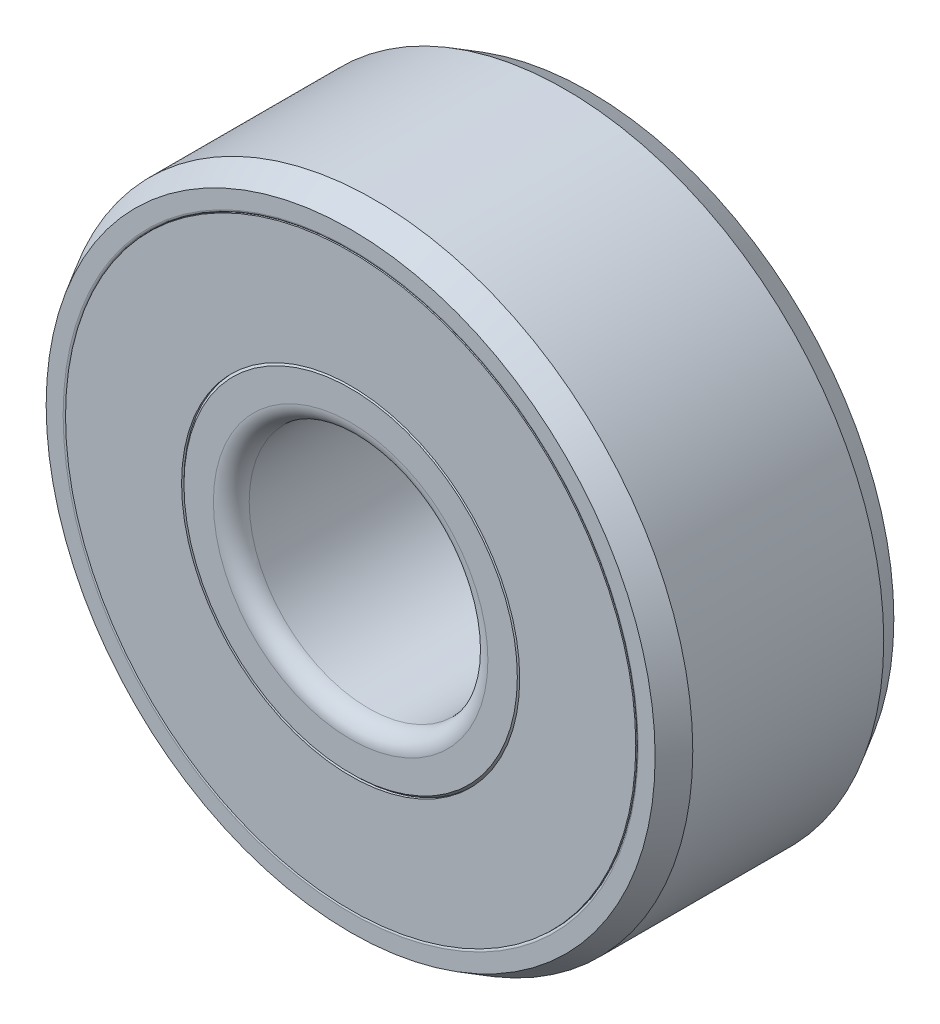
ISO-10303-21;
HEADER;
FILE_DESCRIPTION(('STEP AP214'),'2;1');
FILE_NAME('part.step','',(''),(''),'','','');
FILE_SCHEMA(('AUTOMOTIVE_DESIGN { 1 0 10303 214 1 1 1 1 }'));
ENDSEC;
DATA;
#1=APPLICATION_CONTEXT('core data for automotive mechanical design processes');
#2=APPLICATION_PROTOCOL_DEFINITION('international standard','automotive_design',2000,#1);
#3=PRODUCT_CONTEXT('',#1,'mechanical');
#4=PRODUCT('Part','Part','',(#3));
#5=PRODUCT_RELATED_PRODUCT_CATEGORY('part','',(#4));
#6=PRODUCT_DEFINITION_FORMATION('','',#4);
#7=PRODUCT_DEFINITION_CONTEXT('part definition',#1,'design');
#8=PRODUCT_DEFINITION('design','',#6,#7);
#9=PRODUCT_DEFINITION_SHAPE('','',#8);
#10=(LENGTH_UNIT() NAMED_UNIT(*) SI_UNIT(.MILLI.,.METRE.));
#11=(NAMED_UNIT(*) PLANE_ANGLE_UNIT() SI_UNIT($,.RADIAN.));
#12=(NAMED_UNIT(*) SI_UNIT($,.STERADIAN.) SOLID_ANGLE_UNIT());
#13=UNCERTAINTY_MEASURE_WITH_UNIT(LENGTH_MEASURE(1.E-05),#10,'distance_accuracy_value','');
#14=(GEOMETRIC_REPRESENTATION_CONTEXT(3) GLOBAL_UNCERTAINTY_ASSIGNED_CONTEXT((#13)) GLOBAL_UNIT_ASSIGNED_CONTEXT((#10,
#11,#12)) REPRESENTATION_CONTEXT('',''));
#15=CARTESIAN_POINT('',(0.,0.,0.));
#16=DIRECTION('',(0.,0.,1.));
#17=DIRECTION('',(1.,0.,0.));
#18=AXIS2_PLACEMENT_3D('',#15,#16,#17);
#19=CARTESIAN_POINT('',(2.23147735621081,-1.77954380947183,0.));
#20=DIRECTION('',(-0.781831482468022,0.623489801858743,0.));
#21=DIRECTION('',(0.,0.,-1.));
#22=AXIS2_PLACEMENT_3D('',#19,#20,#21);
#23=SPHERICAL_SURFACE('',#22,1.00694444444444);
#24=CARTESIAN_POINT('',(1.44421648844787,-1.1517242173224,0.));
#25=VERTEX_POINT('',#24);
#26=VERTEX_LOOP('',#25);
#27=FACE_BOUND('',#26,.T.);
#28=ADVANCED_FACE('F41',(#27),#23,.T.);
#29=CLOSED_SHELL('',(#28));
#30=MANIFOLD_SOLID_BREP('B2',#29);
#31=CARTESIAN_POINT('',(2.78260674935229,0.635111832333621,0.));
#32=DIRECTION('',(-0.974927912181826,-0.222520933956305,0.));
#33=DIRECTION('',(0.,0.,-1.));
#34=AXIS2_PLACEMENT_3D('',#31,#32,#33);
#35=SPHERICAL_SURFACE('',#34,1.00694444444444);
#36=CARTESIAN_POINT('',(1.80090850444698,0.41104561411373,0.));
#37=VERTEX_POINT('',#36);
#38=VERTEX_LOOP('',#37);
#39=FACE_BOUND('',#38,.T.);
#40=ADVANCED_FACE('F59',(#39),#35,.T.);
#41=CLOSED_SHELL('',(#40));
#42=MANIFOLD_SOLID_BREP('B6',#41);
#43=CARTESIAN_POINT('',(1.23837650539805,2.57151531047148,0.));
#44=DIRECTION('',(-0.433883739117565,-0.900968867902416,0.));
#45=DIRECTION('',(0.,0.,-1.));
#46=AXIS2_PLACEMENT_3D('',#43,#44,#45);
#47=SPHERICAL_SURFACE('',#46,1.00694444444444);
#48=CARTESIAN_POINT('',(0.801479684758836,1.66428971431974,0.));
#49=VERTEX_POINT('',#48);
#50=VERTEX_LOOP('',#49);
#51=FACE_BOUND('',#50,.T.);
#52=ADVANCED_FACE('F78',(#51),#47,.T.);
#53=CLOSED_SHELL('',(#52));
#54=MANIFOLD_SOLID_BREP('B37',#53);
#55=CARTESIAN_POINT('',(-1.23837650539801,2.5715153104715,0.));
#56=DIRECTION('',(0.433883739117553,-0.900968867902422,0.));
#57=DIRECTION('',(0.,0.,-1.));
#58=AXIS2_PLACEMENT_3D('',#55,#56,#57);
#59=SPHERICAL_SURFACE('',#58,1.00694444444444);
#60=CARTESIAN_POINT('',(-0.801479684758812,1.66428971431975,0.));
#61=VERTEX_POINT('',#60);
#62=VERTEX_LOOP('',#61);
#63=FACE_BOUND('',#62,.T.);
#64=ADVANCED_FACE('F96',(#63),#59,.T.);
#65=CLOSED_SHELL('',(#64));
#66=MANIFOLD_SOLID_BREP('B55',#65);
#67=CARTESIAN_POINT('',(-2.78260674935229,0.635111832333658,0.));
#68=DIRECTION('',(0.974927912181823,-0.222520933956318,0.));
#69=DIRECTION('',(0.,0.,-1.));
#70=AXIS2_PLACEMENT_3D('',#67,#68,#69);
#71=SPHERICAL_SURFACE('',#70,1.00694444444444);
#72=CARTESIAN_POINT('',(-1.80090850444698,0.411045614113755,0.));
#73=VERTEX_POINT('',#72);
#74=VERTEX_LOOP('',#73);
#75=FACE_BOUND('',#74,.T.);
#76=ADVANCED_FACE('F114',(#75),#71,.T.);
#77=CLOSED_SHELL('',(#76));
#78=MANIFOLD_SOLID_BREP('B74',#77);
#79=CARTESIAN_POINT('',(-2.23147735621084,-1.7795438094718,0.));
#80=DIRECTION('',(0.781831482468031,0.623489801858732,0.));
#81=DIRECTION('',(0.,0.,-1.));
#82=AXIS2_PLACEMENT_3D('',#79,#80,#81);
#83=SPHERICAL_SURFACE('',#82,1.00694444444444);
#84=CARTESIAN_POINT('',(-1.44421648844789,-1.15172421732238,0.));
#85=VERTEX_POINT('',#84);
#86=VERTEX_LOOP('',#85);
#87=FACE_BOUND('',#86,.T.);
#88=ADVANCED_FACE('F132',(#87),#83,.T.);
#89=CLOSED_SHELL('',(#88));
#90=MANIFOLD_SOLID_BREP('B92',#89);
#91=CARTESIAN_POINT('',(0.,-2.85416666666667,0.));
#92=DIRECTION('',(0.,1.,0.));
#93=DIRECTION('',(0.,0.,-1.));
#94=AXIS2_PLACEMENT_3D('',#91,#92,#93);
#95=SPHERICAL_SURFACE('',#94,1.00694444444444);
#96=CARTESIAN_POINT('',(0.,-1.84722222222222,0.));
#97=VERTEX_POINT('',#96);
#98=VERTEX_LOOP('',#97);
#99=FACE_BOUND('',#98,.T.);
#100=ADVANCED_FACE('F152',(#99),#95,.T.);
#101=CLOSED_SHELL('',(#100));
#102=MANIFOLD_SOLID_BREP('B110',#101);
#103=CARTESIAN_POINT('',(0.,-2.125,1.5));
#104=DIRECTION('',(0.,0.,1.));
#105=DIRECTION('',(1.,0.,0.));
#106=AXIS2_PLACEMENT_3D('',#103,#104,#105);
#107=PLANE('',#106);
#108=CARTESIAN_POINT('',(0.,0.,1.5));
#109=DIRECTION('',(0.,0.,1.));
#110=DIRECTION('',(1.,0.,0.));
#111=AXIS2_PLACEMENT_3D('',#108,#109,#110);
#112=CIRCLE('',#111,3.58333333333333);
#113=CARTESIAN_POINT('',(3.58333333333333,0.,1.5));
#114=VERTEX_POINT('',#113);
#115=EDGE_CURVE('E151',#114,#114,#112,.T.);
#116=ORIENTED_EDGE('',*,*,#115,.T.);
#117=EDGE_LOOP('',(#116));
#118=FACE_BOUND('',#117,.T.);
#119=CARTESIAN_POINT('',(0.,0.,1.5));
#120=DIRECTION('',(0.,0.,1.));
#121=DIRECTION('',(1.,0.,0.));
#122=AXIS2_PLACEMENT_3D('',#119,#120,#121);
#123=CIRCLE('',#122,2.125);
#124=CARTESIAN_POINT('',(2.125,0.,1.5));
#125=VERTEX_POINT('',#124);
#126=EDGE_CURVE('E187',#125,#125,#123,.T.);
#127=ORIENTED_EDGE('',*,*,#126,.F.);
#128=EDGE_LOOP('',(#127));
#129=FACE_BOUND('',#128,.T.);
#130=ADVANCED_FACE('F172',(#118,#129),#107,.T.);
#131=CARTESIAN_POINT('',(0.,0.,1.5));
#132=DIRECTION('',(0.,0.,1.));
#133=DIRECTION('',(1.,0.,0.));
#134=AXIS2_PLACEMENT_3D('',#131,#132,#133);
#135=CYLINDRICAL_SURFACE('',#134,3.58333333333333);
#136=CARTESIAN_POINT('',(0.,0.,1.13020833333333));
#137=DIRECTION('',(0.,0.,1.));
#138=DIRECTION('',(1.,0.,0.));
#139=AXIS2_PLACEMENT_3D('',#136,#137,#138);
#140=CIRCLE('',#139,3.58333333333333);
#141=CARTESIAN_POINT('',(3.58333333333333,0.,1.13020833333333));
#142=VERTEX_POINT('',#141);
#143=EDGE_CURVE('E178',#142,#142,#140,.T.);
#144=ORIENTED_EDGE('',*,*,#143,.T.);
#145=EDGE_LOOP('',(#144));
#146=FACE_BOUND('',#145,.T.);
#147=ORIENTED_EDGE('',*,*,#115,.F.);
#148=EDGE_LOOP('',(#147));
#149=FACE_BOUND('',#148,.T.);
#150=ADVANCED_FACE('F197',(#146,#149),#135,.T.);
#151=CARTESIAN_POINT('',(0.,-2.125,1.13020833333333));
#152=DIRECTION('',(0.,0.,-1.));
#153=DIRECTION('',(-1.,0.,0.));
#154=AXIS2_PLACEMENT_3D('',#151,#152,#153);
#155=PLANE('',#154);
#156=CARTESIAN_POINT('',(0.,0.,1.13020833333333));
#157=DIRECTION('',(0.,0.,1.));
#158=DIRECTION('',(1.,0.,0.));
#159=AXIS2_PLACEMENT_3D('',#156,#157,#158);
#160=CIRCLE('',#159,2.125);
#161=CARTESIAN_POINT('',(2.125,0.,1.13020833333333));
#162=VERTEX_POINT('',#161);
#163=EDGE_CURVE('E183',#162,#162,#160,.T.);
#164=ORIENTED_EDGE('',*,*,#163,.T.);
#165=EDGE_LOOP('',(#164));
#166=FACE_BOUND('',#165,.T.);
#167=ORIENTED_EDGE('',*,*,#143,.F.);
#168=EDGE_LOOP('',(#167));
#169=FACE_BOUND('',#168,.T.);
#170=ADVANCED_FACE('F201',(#166,#169),#155,.T.);
#171=CARTESIAN_POINT('',(0.,0.,1.5));
#172=DIRECTION('',(0.,0.,1.));
#173=DIRECTION('',(1.,0.,0.));
#174=AXIS2_PLACEMENT_3D('',#171,#172,#173);
#175=CYLINDRICAL_SURFACE('',#174,2.125);
#176=ORIENTED_EDGE('',*,*,#126,.T.);
#177=EDGE_LOOP('',(#176));
#178=FACE_BOUND('',#177,.T.);
#179=ORIENTED_EDGE('',*,*,#163,.F.);
#180=EDGE_LOOP('',(#179));
#181=FACE_BOUND('',#180,.T.);
#182=ADVANCED_FACE('F193',(#178,#181),#175,.F.);
#183=CLOSED_SHELL('',(#130,#150,#170,#182));
#184=MANIFOLD_SOLID_BREP('B128',#183);
#185=CARTESIAN_POINT('',(0.,0.,1.275));
#186=DIRECTION('',(0.,0.,1.));
#187=DIRECTION('',(1.,0.,0.));
#188=AXIS2_PLACEMENT_3D('',#185,#186,#187);
#189=TOROIDAL_SURFACE('',#188,1.725,0.225);
#190=CARTESIAN_POINT('',(0.,0.,1.5));
#191=DIRECTION('',(0.,0.,1.));
#192=DIRECTION('',(1.,0.,0.));
#193=AXIS2_PLACEMENT_3D('',#190,#191,#192);
#194=CIRCLE('',#193,1.725);
#195=CARTESIAN_POINT('',(1.725,0.,1.5));
#196=VERTEX_POINT('',#195);
#197=EDGE_CURVE('E171',#196,#196,#194,.T.);
#198=ORIENTED_EDGE('',*,*,#197,.T.);
#199=EDGE_LOOP('',(#198));
#200=FACE_BOUND('',#199,.T.);
#201=CARTESIAN_POINT('',(0.,0.,1.275));
#202=DIRECTION('',(0.,0.,1.));
#203=DIRECTION('',(1.,0.,0.));
#204=AXIS2_PLACEMENT_3D('',#201,#202,#203);
#205=CIRCLE('',#204,1.5);
#206=CARTESIAN_POINT('',(1.5,0.,1.275));
#207=VERTEX_POINT('',#206);
#208=EDGE_CURVE('E281',#207,#207,#205,.T.);
#209=ORIENTED_EDGE('',*,*,#208,.F.);
#210=EDGE_LOOP('',(#209));
#211=FACE_BOUND('',#210,.T.);
#212=ADVANCED_FACE('F241',(#200,#211),#189,.T.);
#213=CARTESIAN_POINT('',(0.,-2.095,1.5));
#214=DIRECTION('',(0.,0.,1.));
#215=DIRECTION('',(1.,0.,0.));
#216=AXIS2_PLACEMENT_3D('',#213,#214,#215);
#217=PLANE('',#216);
#218=CARTESIAN_POINT('',(0.,0.,1.5));
#219=DIRECTION('',(0.,0.,1.));
#220=DIRECTION('',(1.,0.,0.));
#221=AXIS2_PLACEMENT_3D('',#218,#219,#220);
#222=CIRCLE('',#221,2.095);
#223=CARTESIAN_POINT('',(2.095,0.,1.5));
#224=VERTEX_POINT('',#223);
#225=EDGE_CURVE('E247',#224,#224,#222,.T.);
#226=ORIENTED_EDGE('',*,*,#225,.T.);
#227=EDGE_LOOP('',(#226));
#228=FACE_BOUND('',#227,.T.);
#229=ORIENTED_EDGE('',*,*,#197,.F.);
#230=EDGE_LOOP('',(#229));
#231=FACE_BOUND('',#230,.T.);
#232=ADVANCED_FACE('F289',(#228,#231),#217,.T.);
#233=CARTESIAN_POINT('',(0.,0.,1.5));
#234=DIRECTION('',(0.,0.,-1.));
#235=DIRECTION('',(-1.,0.,0.));
#236=AXIS2_PLACEMENT_3D('',#233,#234,#235);
#237=CONICAL_SURFACE('',#236,2.095,0.785398163397455);
#238=CARTESIAN_POINT('',(0.,0.,1.47));
#239=DIRECTION('',(0.,0.,1.));
#240=DIRECTION('',(1.,0.,0.));
#241=AXIS2_PLACEMENT_3D('',#238,#239,#240);
#242=CIRCLE('',#241,2.125);
#243=CARTESIAN_POINT('',(2.125,0.,1.47));
#244=VERTEX_POINT('',#243);
#245=EDGE_CURVE('E251',#244,#244,#242,.T.);
#246=ORIENTED_EDGE('',*,*,#245,.T.);
#247=EDGE_LOOP('',(#246));
#248=FACE_BOUND('',#247,.T.);
#249=ORIENTED_EDGE('',*,*,#225,.F.);
#250=EDGE_LOOP('',(#249));
#251=FACE_BOUND('',#250,.T.);
#252=ADVANCED_FACE('F293',(#248,#251),#237,.T.);
#253=CARTESIAN_POINT('',(0.,0.,1.5));
#254=DIRECTION('',(0.,0.,1.));
#255=DIRECTION('',(1.,0.,0.));
#256=AXIS2_PLACEMENT_3D('',#253,#254,#255);
#257=CYLINDRICAL_SURFACE('',#256,2.125);
#258=CARTESIAN_POINT('',(0.,0.,0.694444444444445));
#259=DIRECTION('',(0.,0.,1.));
#260=DIRECTION('',(1.,0.,0.));
#261=AXIS2_PLACEMENT_3D('',#258,#259,#260);
#262=CIRCLE('',#261,2.125);
#263=CARTESIAN_POINT('',(2.125,0.,0.694444444444445));
#264=VERTEX_POINT('',#263);
#265=EDGE_CURVE('E255',#264,#264,#262,.T.);
#266=ORIENTED_EDGE('',*,*,#265,.T.);
#267=EDGE_LOOP('',(#266));
#268=FACE_BOUND('',#267,.T.);
#269=ORIENTED_EDGE('',*,*,#245,.F.);
#270=EDGE_LOOP('',(#269));
#271=FACE_BOUND('',#270,.T.);
#272=ADVANCED_FACE('F297',(#268,#271),#257,.T.);
#273=CARTESIAN_POINT('',(0.,0.,0.));
#274=DIRECTION('',(0.,0.,1.));
#275=DIRECTION('',(1.,0.,0.));
#276=AXIS2_PLACEMENT_3D('',#273,#274,#275);
#277=TOROIDAL_SURFACE('',#276,2.85416666666667,1.00694444444444);
#278=CARTESIAN_POINT('',(0.,0.,-0.694444444444445));
#279=DIRECTION('',(0.,0.,1.));
#280=DIRECTION('',(1.,0.,0.));
#281=AXIS2_PLACEMENT_3D('',#278,#279,#280);
#282=CIRCLE('',#281,2.125);
#283=CARTESIAN_POINT('',(2.125,0.,-0.694444444444445));
#284=VERTEX_POINT('',#283);
#285=EDGE_CURVE('E261',#284,#284,#282,.T.);
#286=ORIENTED_EDGE('',*,*,#285,.T.);
#287=EDGE_LOOP('',(#286));
#288=FACE_BOUND('',#287,.T.);
#289=ORIENTED_EDGE('',*,*,#265,.F.);
#290=EDGE_LOOP('',(#289));
#291=FACE_BOUND('',#290,.T.);
#292=ADVANCED_FACE('F304',(#288,#291),#277,.F.);
#293=CARTESIAN_POINT('',(0.,0.,1.5));
#294=DIRECTION('',(0.,0.,1.));
#295=DIRECTION('',(1.,0.,0.));
#296=AXIS2_PLACEMENT_3D('',#293,#294,#295);
#297=CYLINDRICAL_SURFACE('',#296,2.125);
#298=CARTESIAN_POINT('',(0.,0.,-1.47));
#299=DIRECTION('',(0.,0.,1.));
#300=DIRECTION('',(1.,0.,0.));
#301=AXIS2_PLACEMENT_3D('',#298,#299,#300);
#302=CIRCLE('',#301,2.125);
#303=CARTESIAN_POINT('',(2.125,0.,-1.47));
#304=VERTEX_POINT('',#303);
#305=EDGE_CURVE('E265',#304,#304,#302,.T.);
#306=ORIENTED_EDGE('',*,*,#305,.T.);
#307=EDGE_LOOP('',(#306));
#308=FACE_BOUND('',#307,.T.);
#309=ORIENTED_EDGE('',*,*,#285,.F.);
#310=EDGE_LOOP('',(#309));
#311=FACE_BOUND('',#310,.T.);
#312=ADVANCED_FACE('F308',(#308,#311),#297,.T.);
#313=CARTESIAN_POINT('',(0.,0.,-1.47));
#314=DIRECTION('',(0.,0.,1.));
#315=DIRECTION('',(1.,0.,0.));
#316=AXIS2_PLACEMENT_3D('',#313,#314,#315);
#317=CONICAL_SURFACE('',#316,2.125,0.785398163397455);
#318=CARTESIAN_POINT('',(0.,0.,-1.5));
#319=DIRECTION('',(0.,0.,1.));
#320=DIRECTION('',(1.,0.,0.));
#321=AXIS2_PLACEMENT_3D('',#318,#319,#320);
#322=CIRCLE('',#321,2.095);
#323=CARTESIAN_POINT('',(2.095,0.,-1.5));
#324=VERTEX_POINT('',#323);
#325=EDGE_CURVE('E269',#324,#324,#322,.T.);
#326=ORIENTED_EDGE('',*,*,#325,.T.);
#327=EDGE_LOOP('',(#326));
#328=FACE_BOUND('',#327,.T.);
#329=ORIENTED_EDGE('',*,*,#305,.F.);
#330=EDGE_LOOP('',(#329));
#331=FACE_BOUND('',#330,.T.);
#332=ADVANCED_FACE('F312',(#328,#331),#317,.T.);
#333=CARTESIAN_POINT('',(0.,-2.095,-1.5));
#334=DIRECTION('',(0.,0.,-1.));
#335=DIRECTION('',(-1.,0.,0.));
#336=AXIS2_PLACEMENT_3D('',#333,#334,#335);
#337=PLANE('',#336);
#338=CARTESIAN_POINT('',(0.,0.,-1.5));
#339=DIRECTION('',(0.,0.,1.));
#340=DIRECTION('',(1.,0.,0.));
#341=AXIS2_PLACEMENT_3D('',#338,#339,#340);
#342=CIRCLE('',#341,1.725);
#343=CARTESIAN_POINT('',(1.725,0.,-1.5));
#344=VERTEX_POINT('',#343);
#345=EDGE_CURVE('E273',#344,#344,#342,.T.);
#346=ORIENTED_EDGE('',*,*,#345,.T.);
#347=EDGE_LOOP('',(#346));
#348=FACE_BOUND('',#347,.T.);
#349=ORIENTED_EDGE('',*,*,#325,.F.);
#350=EDGE_LOOP('',(#349));
#351=FACE_BOUND('',#350,.T.);
#352=ADVANCED_FACE('F316',(#348,#351),#337,.T.);
#353=CARTESIAN_POINT('',(0.,0.,-1.275));
#354=DIRECTION('',(0.,0.,1.));
#355=DIRECTION('',(1.,0.,0.));
#356=AXIS2_PLACEMENT_3D('',#353,#354,#355);
#357=TOROIDAL_SURFACE('',#356,1.725,0.225);
#358=CARTESIAN_POINT('',(0.,0.,-1.275));
#359=DIRECTION('',(0.,0.,1.));
#360=DIRECTION('',(1.,0.,0.));
#361=AXIS2_PLACEMENT_3D('',#358,#359,#360);
#362=CIRCLE('',#361,1.5);
#363=CARTESIAN_POINT('',(1.5,0.,-1.275));
#364=VERTEX_POINT('',#363);
#365=EDGE_CURVE('E277',#364,#364,#362,.T.);
#366=ORIENTED_EDGE('',*,*,#365,.T.);
#367=EDGE_LOOP('',(#366));
#368=FACE_BOUND('',#367,.T.);
#369=ORIENTED_EDGE('',*,*,#345,.F.);
#370=EDGE_LOOP('',(#369));
#371=FACE_BOUND('',#370,.T.);
#372=ADVANCED_FACE('F320',(#368,#371),#357,.T.);
#373=CARTESIAN_POINT('',(0.,0.,1.5));
#374=DIRECTION('',(0.,0.,1.));
#375=DIRECTION('',(1.,0.,0.));
#376=AXIS2_PLACEMENT_3D('',#373,#374,#375);
#377=CYLINDRICAL_SURFACE('',#376,1.5);
#378=ORIENTED_EDGE('',*,*,#208,.T.);
#379=EDGE_LOOP('',(#378));
#380=FACE_BOUND('',#379,.T.);
#381=ORIENTED_EDGE('',*,*,#365,.F.);
#382=EDGE_LOOP('',(#381));
#383=FACE_BOUND('',#382,.T.);
#384=ADVANCED_FACE('F285',(#380,#383),#377,.F.);
#385=CLOSED_SHELL('',(#212,#232,#252,#272,#292,#312,#332,#352,#372,#384));
#386=MANIFOLD_SOLID_BREP('B146',#385);
#387=CARTESIAN_POINT('',(0.,0.,1.5));
#388=DIRECTION('',(0.,0.,-1.));
#389=DIRECTION('',(-1.,0.,0.));
#390=AXIS2_PLACEMENT_3D('',#387,#388,#389);
#391=CONICAL_SURFACE('',#390,3.82679491924312,0.523598775598276);
#392=CARTESIAN_POINT('',(0.,0.,1.2));
#393=DIRECTION('',(0.,0.,1.));
#394=DIRECTION('',(1.,0.,0.));
#395=AXIS2_PLACEMENT_3D('',#392,#393,#394);
#396=CIRCLE('',#395,4.);
#397=CARTESIAN_POINT('',(4.,0.,1.2));
#398=VERTEX_POINT('',#397);
#399=EDGE_CURVE('E240',#398,#398,#396,.T.);
#400=ORIENTED_EDGE('',*,*,#399,.T.);
#401=EDGE_LOOP('',(#400));
#402=FACE_BOUND('',#401,.T.);
#403=CARTESIAN_POINT('',(0.,0.,1.5));
#404=DIRECTION('',(0.,0.,1.));
#405=DIRECTION('',(1.,0.,0.));
#406=AXIS2_PLACEMENT_3D('',#403,#404,#405);
#407=CIRCLE('',#406,3.82679491924312);
#408=CARTESIAN_POINT('',(3.82679491924312,0.,1.5));
#409=VERTEX_POINT('',#408);
#410=EDGE_CURVE('E442',#409,#409,#407,.T.);
#411=ORIENTED_EDGE('',*,*,#410,.F.);
#412=EDGE_LOOP('',(#411));
#413=FACE_BOUND('',#412,.T.);
#414=ADVANCED_FACE('F400',(#402,#413),#391,.T.);
#415=CARTESIAN_POINT('',(0.,0.,1.5));
#416=DIRECTION('',(0.,0.,1.));
#417=DIRECTION('',(1.,0.,0.));
#418=AXIS2_PLACEMENT_3D('',#415,#416,#417);
#419=CYLINDRICAL_SURFACE('',#418,4.);
#420=CARTESIAN_POINT('',(0.,0.,-1.2));
#421=DIRECTION('',(0.,0.,1.));
#422=DIRECTION('',(1.,0.,0.));
#423=AXIS2_PLACEMENT_3D('',#420,#421,#422);
#424=CIRCLE('',#423,4.);
#425=CARTESIAN_POINT('',(4.,0.,-1.2));
#426=VERTEX_POINT('',#425);
#427=EDGE_CURVE('E407',#426,#426,#424,.T.);
#428=ORIENTED_EDGE('',*,*,#427,.T.);
#429=EDGE_LOOP('',(#428));
#430=FACE_BOUND('',#429,.T.);
#431=ORIENTED_EDGE('',*,*,#399,.F.);
#432=EDGE_LOOP('',(#431));
#433=FACE_BOUND('',#432,.T.);
#434=ADVANCED_FACE('F450',(#430,#433),#419,.T.);
#435=CARTESIAN_POINT('',(0.,0.,-1.2));
#436=DIRECTION('',(0.,0.,1.));
#437=DIRECTION('',(1.,0.,0.));
#438=AXIS2_PLACEMENT_3D('',#435,#436,#437);
#439=CONICAL_SURFACE('',#438,4.,0.523598775598276);
#440=CARTESIAN_POINT('',(0.,0.,-1.5));
#441=DIRECTION('',(0.,0.,1.));
#442=DIRECTION('',(1.,0.,0.));
#443=AXIS2_PLACEMENT_3D('',#440,#441,#442);
#444=CIRCLE('',#443,3.82679491924312);
#445=CARTESIAN_POINT('',(3.82679491924312,0.,-1.5));
#446=VERTEX_POINT('',#445);
#447=EDGE_CURVE('E413',#446,#446,#444,.T.);
#448=ORIENTED_EDGE('',*,*,#447,.T.);
#449=EDGE_LOOP('',(#448));
#450=FACE_BOUND('',#449,.T.);
#451=ORIENTED_EDGE('',*,*,#427,.F.);
#452=EDGE_LOOP('',(#451));
#453=FACE_BOUND('',#452,.T.);
#454=ADVANCED_FACE('F454',(#450,#453),#439,.T.);
#455=CARTESIAN_POINT('',(0.,-3.61333333333333,-1.5));
#456=DIRECTION('',(0.,0.,-1.));
#457=DIRECTION('',(-1.,0.,0.));
#458=AXIS2_PLACEMENT_3D('',#455,#456,#457);
#459=PLANE('',#458);
#460=CARTESIAN_POINT('',(0.,0.,-1.5));
#461=DIRECTION('',(0.,0.,1.));
#462=DIRECTION('',(1.,0.,0.));
#463=AXIS2_PLACEMENT_3D('',#460,#461,#462);
#464=CIRCLE('',#463,3.61333333333333);
#465=CARTESIAN_POINT('',(3.61333333333333,0.,-1.5));
#466=VERTEX_POINT('',#465);
#467=EDGE_CURVE('E418',#466,#466,#464,.T.);
#468=ORIENTED_EDGE('',*,*,#467,.T.);
#469=EDGE_LOOP('',(#468));
#470=FACE_BOUND('',#469,.T.);
#471=ORIENTED_EDGE('',*,*,#447,.F.);
#472=EDGE_LOOP('',(#471));
#473=FACE_BOUND('',#472,.T.);
#474=ADVANCED_FACE('F458',(#470,#473),#459,.T.);
#475=CARTESIAN_POINT('',(0.,0.,-1.47));
#476=DIRECTION('',(0.,0.,1.));
#477=DIRECTION('',(1.,0.,0.));
#478=AXIS2_PLACEMENT_3D('',#475,#476,#477);
#479=TOROIDAL_SURFACE('',#478,3.61333333333333,0.0300000000000002);
#480=CARTESIAN_POINT('',(0.,0.,-1.47));
#481=DIRECTION('',(0.,0.,1.));
#482=DIRECTION('',(1.,0.,0.));
#483=AXIS2_PLACEMENT_3D('',#480,#481,#482);
#484=CIRCLE('',#483,3.58333333333333);
#485=CARTESIAN_POINT('',(3.58333333333333,0.,-1.47));
#486=VERTEX_POINT('',#485);
#487=EDGE_CURVE('E424',#486,#486,#484,.T.);
#488=ORIENTED_EDGE('',*,*,#487,.T.);
#489=EDGE_LOOP('',(#488));
#490=FACE_BOUND('',#489,.T.);
#491=ORIENTED_EDGE('',*,*,#467,.F.);
#492=EDGE_LOOP('',(#491));
#493=FACE_BOUND('',#492,.T.);
#494=ADVANCED_FACE('F465',(#490,#493),#479,.T.);
#495=CARTESIAN_POINT('',(0.,0.,1.5));
#496=DIRECTION('',(0.,0.,1.));
#497=DIRECTION('',(1.,0.,0.));
#498=AXIS2_PLACEMENT_3D('',#495,#496,#497);
#499=CYLINDRICAL_SURFACE('',#498,3.58333333333333);
#500=CARTESIAN_POINT('',(0.,0.,-0.694444444444445));
#501=DIRECTION('',(0.,0.,1.));
#502=DIRECTION('',(1.,0.,0.));
#503=AXIS2_PLACEMENT_3D('',#500,#501,#502);
#504=CIRCLE('',#503,3.58333333333333);
#505=CARTESIAN_POINT('',(3.58333333333333,0.,-0.694444444444445));
#506=VERTEX_POINT('',#505);
#507=EDGE_CURVE('E428',#506,#506,#504,.T.);
#508=ORIENTED_EDGE('',*,*,#507,.T.);
#509=EDGE_LOOP('',(#508));
#510=FACE_BOUND('',#509,.T.);
#511=ORIENTED_EDGE('',*,*,#487,.F.);
#512=EDGE_LOOP('',(#511));
#513=FACE_BOUND('',#512,.T.);
#514=ADVANCED_FACE('F469',(#510,#513),#499,.F.);
#515=CARTESIAN_POINT('',(0.,0.,0.));
#516=DIRECTION('',(0.,0.,1.));
#517=DIRECTION('',(1.,0.,0.));
#518=AXIS2_PLACEMENT_3D('',#515,#516,#517);
#519=TOROIDAL_SURFACE('',#518,2.85416666666667,1.00694444444445);
#520=CARTESIAN_POINT('',(0.,0.,0.694444444444445));
#521=DIRECTION('',(0.,0.,1.));
#522=DIRECTION('',(1.,0.,0.));
#523=AXIS2_PLACEMENT_3D('',#520,#521,#522);
#524=CIRCLE('',#523,3.58333333333333);
#525=CARTESIAN_POINT('',(3.58333333333333,0.,0.694444444444445));
#526=VERTEX_POINT('',#525);
#527=EDGE_CURVE('E432',#526,#526,#524,.T.);
#528=ORIENTED_EDGE('',*,*,#527,.T.);
#529=EDGE_LOOP('',(#528));
#530=FACE_BOUND('',#529,.T.);
#531=ORIENTED_EDGE('',*,*,#507,.F.);
#532=EDGE_LOOP('',(#531));
#533=FACE_BOUND('',#532,.T.);
#534=ADVANCED_FACE('F473',(#530,#533),#519,.F.);
#535=CARTESIAN_POINT('',(0.,0.,1.5));
#536=DIRECTION('',(0.,0.,1.));
#537=DIRECTION('',(1.,0.,0.));
#538=AXIS2_PLACEMENT_3D('',#535,#536,#537);
#539=CYLINDRICAL_SURFACE('',#538,3.58333333333333);
#540=CARTESIAN_POINT('',(0.,0.,1.47));
#541=DIRECTION('',(0.,0.,1.));
#542=DIRECTION('',(1.,0.,0.));
#543=AXIS2_PLACEMENT_3D('',#540,#541,#542);
#544=CIRCLE('',#543,3.58333333333333);
#545=CARTESIAN_POINT('',(3.58333333333333,0.,1.47));
#546=VERTEX_POINT('',#545);
#547=EDGE_CURVE('E436',#546,#546,#544,.T.);
#548=ORIENTED_EDGE('',*,*,#547,.T.);
#549=EDGE_LOOP('',(#548));
#550=FACE_BOUND('',#549,.T.);
#551=ORIENTED_EDGE('',*,*,#527,.F.);
#552=EDGE_LOOP('',(#551));
#553=FACE_BOUND('',#552,.T.);
#554=ADVANCED_FACE('F477',(#550,#553),#539,.F.);
#555=CARTESIAN_POINT('',(0.,0.,1.47));
#556=DIRECTION('',(0.,0.,1.));
#557=DIRECTION('',(1.,0.,0.));
#558=AXIS2_PLACEMENT_3D('',#555,#556,#557);
#559=TOROIDAL_SURFACE('',#558,3.61333333333333,0.0300000000000002);
#560=CARTESIAN_POINT('',(0.,0.,1.5));
#561=DIRECTION('',(0.,0.,1.));
#562=DIRECTION('',(1.,0.,0.));
#563=AXIS2_PLACEMENT_3D('',#560,#561,#562);
#564=CIRCLE('',#563,3.61333333333333);
#565=CARTESIAN_POINT('',(3.61333333333333,0.,1.5));
#566=VERTEX_POINT('',#565);
#567=EDGE_CURVE('E439',#566,#566,#564,.T.);
#568=ORIENTED_EDGE('',*,*,#567,.T.);
#569=EDGE_LOOP('',(#568));
#570=FACE_BOUND('',#569,.T.);
#571=ORIENTED_EDGE('',*,*,#547,.F.);
#572=EDGE_LOOP('',(#571));
#573=FACE_BOUND('',#572,.T.);
#574=ADVANCED_FACE('F481',(#570,#573),#559,.T.);
#575=CARTESIAN_POINT('',(0.,-3.61333333333333,1.5));
#576=DIRECTION('',(0.,0.,1.));
#577=DIRECTION('',(1.,0.,0.));
#578=AXIS2_PLACEMENT_3D('',#575,#576,#577);
#579=PLANE('',#578);
#580=ORIENTED_EDGE('',*,*,#410,.T.);
#581=EDGE_LOOP('',(#580));
#582=FACE_BOUND('',#581,.T.);
#583=ORIENTED_EDGE('',*,*,#567,.F.);
#584=EDGE_LOOP('',(#583));
#585=FACE_BOUND('',#584,.T.);
#586=ADVANCED_FACE('F446',(#582,#585),#579,.T.);
#587=CLOSED_SHELL('',(#414,#434,#454,#474,#494,#514,#534,#554,#574,#586));
#588=MANIFOLD_SOLID_BREP('B166',#587);
#589=ADVANCED_BREP_SHAPE_REPRESENTATION('',(#18,#30,#42,#54,#66,#78,#90,#102,#184,#386,#588),#14);
#590=SHAPE_DEFINITION_REPRESENTATION(#9,#589);
ENDSEC;
END-ISO-10303-21;
